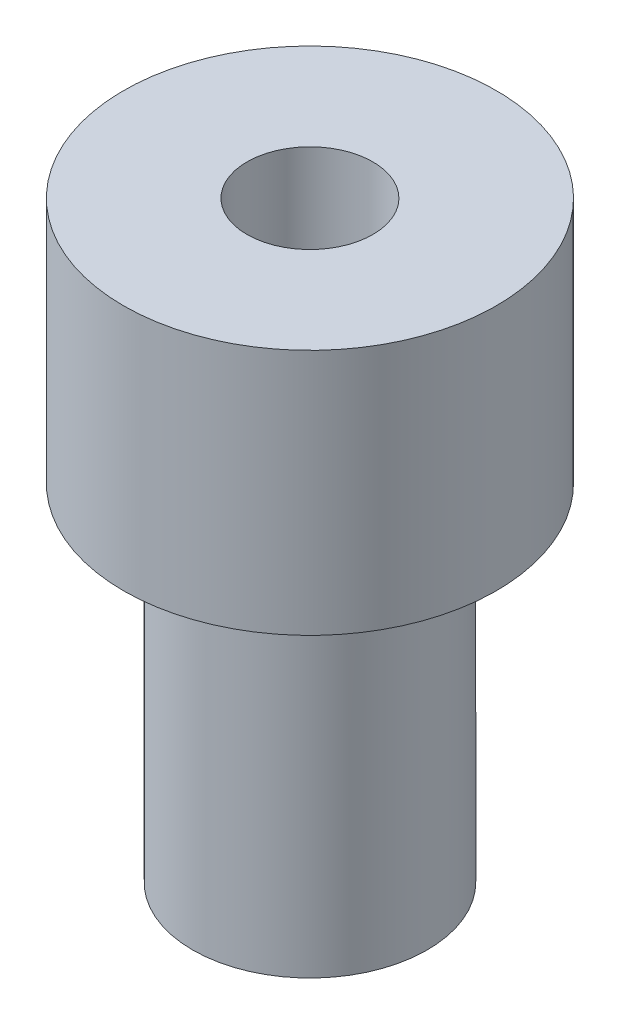
ISO-10303-21;
HEADER;
FILE_DESCRIPTION(('STEP AP214'),'2;1');
FILE_NAME('part.step','',(''),(''),'','','');
FILE_SCHEMA(('AUTOMOTIVE_DESIGN { 1 0 10303 214 1 1 1 1 }'));
ENDSEC;
DATA;
#1=APPLICATION_CONTEXT('core data for automotive mechanical design processes');
#2=APPLICATION_PROTOCOL_DEFINITION('international standard','automotive_design',2000,#1);
#3=PRODUCT_CONTEXT('',#1,'mechanical');
#4=PRODUCT('Part','Part','',(#3));
#5=PRODUCT_RELATED_PRODUCT_CATEGORY('part','',(#4));
#6=PRODUCT_DEFINITION_FORMATION('','',#4);
#7=PRODUCT_DEFINITION_CONTEXT('part definition',#1,'design');
#8=PRODUCT_DEFINITION('design','',#6,#7);
#9=PRODUCT_DEFINITION_SHAPE('','',#8);
#10=(LENGTH_UNIT() NAMED_UNIT(*) SI_UNIT(.MILLI.,.METRE.));
#11=(NAMED_UNIT(*) PLANE_ANGLE_UNIT() SI_UNIT($,.RADIAN.));
#12=(NAMED_UNIT(*) SI_UNIT($,.STERADIAN.) SOLID_ANGLE_UNIT());
#13=UNCERTAINTY_MEASURE_WITH_UNIT(LENGTH_MEASURE(1.E-05),#10,'distance_accuracy_value','');
#14=(GEOMETRIC_REPRESENTATION_CONTEXT(3) GLOBAL_UNCERTAINTY_ASSIGNED_CONTEXT((#13)) GLOBAL_UNIT_ASSIGNED_CONTEXT((#10,
#11,#12)) REPRESENTATION_CONTEXT('',''));
#15=CARTESIAN_POINT('',(0.,0.,0.));
#16=DIRECTION('',(0.,0.,1.));
#17=DIRECTION('',(1.,0.,0.));
#18=AXIS2_PLACEMENT_3D('',#15,#16,#17);
#19=CARTESIAN_POINT('',(-4.75,0.,0.));
#20=DIRECTION('',(0.,-1.,0.));
#21=DIRECTION('',(0.,0.,-1.));
#22=AXIS2_PLACEMENT_3D('',#19,#20,#21);
#23=PLANE('',#22);
#24=CARTESIAN_POINT('',(0.,0.,0.));
#25=DIRECTION('',(0.,1.,0.));
#26=DIRECTION('',(0.,0.,1.));
#27=AXIS2_PLACEMENT_3D('',#24,#25,#26);
#28=CIRCLE('',#27,2.55);
#29=CARTESIAN_POINT('',(0.,0.,2.55));
#30=VERTEX_POINT('',#29);
#31=EDGE_CURVE('E53',#30,#30,#28,.T.);
#32=ORIENTED_EDGE('',*,*,#31,.T.);
#33=EDGE_LOOP('',(#32));
#34=FACE_BOUND('',#33,.T.);
#35=CARTESIAN_POINT('',(0.,0.,0.));
#36=DIRECTION('',(0.,1.,0.));
#37=DIRECTION('',(0.,0.,1.));
#38=AXIS2_PLACEMENT_3D('',#35,#36,#37);
#39=CIRCLE('',#38,4.75);
#40=CARTESIAN_POINT('',(0.,0.,4.75));
#41=VERTEX_POINT('',#40);
#42=EDGE_CURVE('E72',#41,#41,#39,.T.);
#43=ORIENTED_EDGE('',*,*,#42,.F.);
#44=EDGE_LOOP('',(#43));
#45=FACE_BOUND('',#44,.T.);
#46=ADVANCED_FACE('F39',(#34,#45),#23,.T.);
#47=CARTESIAN_POINT('',(0.,5.17341155810984,0.));
#48=DIRECTION('',(0.,1.,0.));
#49=DIRECTION('',(0.,0.,1.));
#50=AXIS2_PLACEMENT_3D('',#47,#48,#49);
#51=CYLINDRICAL_SURFACE('',#50,2.55);
#52=CARTESIAN_POINT('',(0.,24.,0.));
#53=DIRECTION('',(0.,1.,0.));
#54=DIRECTION('',(0.,0.,1.));
#55=AXIS2_PLACEMENT_3D('',#52,#53,#54);
#56=CIRCLE('',#55,2.55);
#57=CARTESIAN_POINT('',(0.,24.,2.55));
#58=VERTEX_POINT('',#57);
#59=EDGE_CURVE('E58',#58,#58,#56,.T.);
#60=ORIENTED_EDGE('',*,*,#59,.T.);
#61=EDGE_LOOP('',(#60));
#62=FACE_BOUND('',#61,.T.);
#63=ORIENTED_EDGE('',*,*,#31,.F.);
#64=EDGE_LOOP('',(#63));
#65=FACE_BOUND('',#64,.T.);
#66=ADVANCED_FACE('F80',(#62,#65),#51,.F.);
#67=CARTESIAN_POINT('',(-2.55,24.,0.));
#68=DIRECTION('',(0.,1.,0.));
#69=DIRECTION('',(0.,0.,1.));
#70=AXIS2_PLACEMENT_3D('',#67,#68,#69);
#71=PLANE('',#70);
#72=CARTESIAN_POINT('',(0.,24.,0.));
#73=DIRECTION('',(0.,1.,0.));
#74=DIRECTION('',(0.,0.,1.));
#75=AXIS2_PLACEMENT_3D('',#72,#73,#74);
#76=CIRCLE('',#75,7.55);
#77=CARTESIAN_POINT('',(0.,24.,7.55));
#78=VERTEX_POINT('',#77);
#79=EDGE_CURVE('E64',#78,#78,#76,.T.);
#80=ORIENTED_EDGE('',*,*,#79,.T.);
#81=EDGE_LOOP('',(#80));
#82=FACE_BOUND('',#81,.T.);
#83=ORIENTED_EDGE('',*,*,#59,.F.);
#84=EDGE_LOOP('',(#83));
#85=FACE_BOUND('',#84,.T.);
#86=ADVANCED_FACE('F85',(#82,#85),#71,.T.);
#87=CARTESIAN_POINT('',(0.,5.17341155810984,0.));
#88=DIRECTION('',(0.,1.,0.));
#89=DIRECTION('',(0.,0.,1.));
#90=AXIS2_PLACEMENT_3D('',#87,#88,#89);
#91=CYLINDRICAL_SURFACE('',#90,7.55);
#92=CARTESIAN_POINT('',(0.,14.,0.));
#93=DIRECTION('',(0.,1.,0.));
#94=DIRECTION('',(0.,0.,1.));
#95=AXIS2_PLACEMENT_3D('',#92,#93,#94);
#96=CIRCLE('',#95,7.55);
#97=CARTESIAN_POINT('',(0.,14.,7.55));
#98=VERTEX_POINT('',#97);
#99=EDGE_CURVE('E68',#98,#98,#96,.T.);
#100=ORIENTED_EDGE('',*,*,#99,.T.);
#101=EDGE_LOOP('',(#100));
#102=FACE_BOUND('',#101,.T.);
#103=ORIENTED_EDGE('',*,*,#79,.F.);
#104=EDGE_LOOP('',(#103));
#105=FACE_BOUND('',#104,.T.);
#106=ADVANCED_FACE('F91',(#102,#105),#91,.T.);
#107=CARTESIAN_POINT('',(-7.55,14.,0.));
#108=DIRECTION('',(0.,-1.,0.));
#109=DIRECTION('',(0.,0.,-1.));
#110=AXIS2_PLACEMENT_3D('',#107,#108,#109);
#111=PLANE('',#110);
#112=CARTESIAN_POINT('',(0.,14.,0.));
#113=DIRECTION('',(0.,-1.,0.));
#114=DIRECTION('',(0.,0.,-1.));
#115=AXIS2_PLACEMENT_3D('',#112,#113,#114);
#116=CIRCLE('',#115,5.15000000000001);
#117=CARTESIAN_POINT('',(0.,14.,-5.15000000000001));
#118=VERTEX_POINT('',#117);
#119=EDGE_CURVE('E48',#118,#118,#116,.F.);
#120=ORIENTED_EDGE('',*,*,#119,.T.);
#121=EDGE_LOOP('',(#120));
#122=FACE_BOUND('',#121,.T.);
#123=ORIENTED_EDGE('',*,*,#99,.F.);
#124=EDGE_LOOP('',(#123));
#125=FACE_BOUND('',#124,.T.);
#126=ADVANCED_FACE('F95',(#122,#125),#111,.T.);
#127=CARTESIAN_POINT('',(0.,5.17341155810984,0.));
#128=DIRECTION('',(0.,1.,0.));
#129=DIRECTION('',(0.,0.,1.));
#130=AXIS2_PLACEMENT_3D('',#127,#128,#129);
#131=CYLINDRICAL_SURFACE('',#130,4.75);
#132=CARTESIAN_POINT('',(0.,13.6,0.));
#133=DIRECTION('',(0.,-1.,0.));
#134=DIRECTION('',(0.,0.,-1.));
#135=AXIS2_PLACEMENT_3D('',#132,#133,#134);
#136=CIRCLE('',#135,4.75);
#137=CARTESIAN_POINT('',(0.,13.6,-4.75));
#138=VERTEX_POINT('',#137);
#139=EDGE_CURVE('E10',#138,#138,#136,.T.);
#140=ORIENTED_EDGE('',*,*,#139,.T.);
#141=EDGE_LOOP('',(#140));
#142=FACE_BOUND('',#141,.T.);
#143=ORIENTED_EDGE('',*,*,#42,.T.);
#144=EDGE_LOOP('',(#143));
#145=FACE_BOUND('',#144,.T.);
#146=ADVANCED_FACE('F77',(#142,#145),#131,.T.);
#147=CARTESIAN_POINT('',(0.,14.,0.));
#148=DIRECTION('',(0.,1.,0.));
#149=DIRECTION('',(0.,0.,1.));
#150=AXIS2_PLACEMENT_3D('',#147,#148,#149);
#151=CONICAL_SURFACE('',#150,5.15000000000001,0.785398163397455);
#152=ORIENTED_EDGE('',*,*,#139,.F.);
#153=EDGE_LOOP('',(#152));
#154=FACE_BOUND('',#153,.T.);
#155=ORIENTED_EDGE('',*,*,#119,.F.);
#156=EDGE_LOOP('',(#155));
#157=FACE_BOUND('',#156,.T.);
#158=ADVANCED_FACE('F42',(#154,#157),#151,.T.);
#159=CLOSED_SHELL('',(#46,#66,#86,#106,#126,#146,#158));
#160=MANIFOLD_SOLID_BREP('B2',#159);
#161=ADVANCED_BREP_SHAPE_REPRESENTATION('',(#18,#160),#14);
#162=SHAPE_DEFINITION_REPRESENTATION(#9,#161);
ENDSEC;
END-ISO-10303-21;
